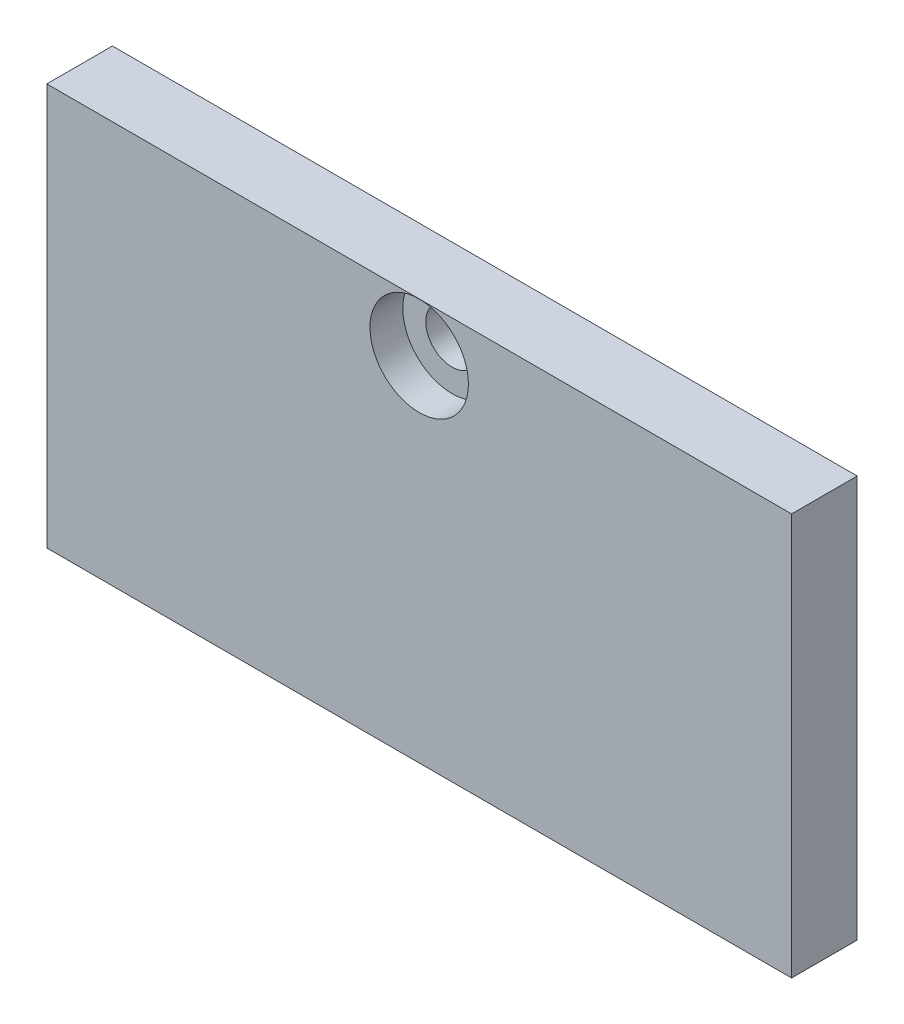
ISO-10303-21;
HEADER;
FILE_DESCRIPTION(('STEP AP214'),'2;1');
FILE_NAME('part.step','',(''),(''),'','','');
FILE_SCHEMA(('AUTOMOTIVE_DESIGN { 1 0 10303 214 1 1 1 1 }'));
ENDSEC;
DATA;
#1=APPLICATION_CONTEXT('core data for automotive mechanical design processes');
#2=APPLICATION_PROTOCOL_DEFINITION('international standard','automotive_design',2000,#1);
#3=PRODUCT_CONTEXT('',#1,'mechanical');
#4=PRODUCT('Part','Part','',(#3));
#5=PRODUCT_RELATED_PRODUCT_CATEGORY('part','',(#4));
#6=PRODUCT_DEFINITION_FORMATION('','',#4);
#7=PRODUCT_DEFINITION_CONTEXT('part definition',#1,'design');
#8=PRODUCT_DEFINITION('design','',#6,#7);
#9=PRODUCT_DEFINITION_SHAPE('','',#8);
#10=(LENGTH_UNIT() NAMED_UNIT(*) SI_UNIT(.MILLI.,.METRE.));
#11=(NAMED_UNIT(*) PLANE_ANGLE_UNIT() SI_UNIT($,.RADIAN.));
#12=(NAMED_UNIT(*) SI_UNIT($,.STERADIAN.) SOLID_ANGLE_UNIT());
#13=UNCERTAINTY_MEASURE_WITH_UNIT(LENGTH_MEASURE(1.E-05),#10,'distance_accuracy_value','');
#14=(GEOMETRIC_REPRESENTATION_CONTEXT(3) GLOBAL_UNCERTAINTY_ASSIGNED_CONTEXT((#13)) GLOBAL_UNIT_ASSIGNED_CONTEXT((#10,
#11,#12)) REPRESENTATION_CONTEXT('',''));
#15=CARTESIAN_POINT('',(0.,0.,0.));
#16=DIRECTION('',(0.,0.,1.));
#17=DIRECTION('',(1.,0.,0.));
#18=AXIS2_PLACEMENT_3D('',#15,#16,#17);
#19=CARTESIAN_POINT('',(-53.7538152649901,35.2169951487221,0.));
#20=DIRECTION('',(0.,0.,1.));
#21=DIRECTION('',(1.,0.,0.));
#22=AXIS2_PLACEMENT_3D('',#19,#20,#21);
#23=CYLINDRICAL_SURFACE('',#22,1.6);
#24=CARTESIAN_POINT('',(-53.7538152649901,35.2169951487221,0.));
#25=DIRECTION('',(0.,0.,1.));
#26=DIRECTION('',(1.,0.,0.));
#27=AXIS2_PLACEMENT_3D('',#24,#25,#26);
#28=CIRCLE('',#27,1.6);
#29=CARTESIAN_POINT('',(-52.1538152649901,35.2169951487221,0.));
#30=VERTEX_POINT('',#29);
#31=EDGE_CURVE('E182',#30,#30,#28,.T.);
#32=ORIENTED_EDGE('',*,*,#31,.F.);
#33=EDGE_LOOP('',(#32));
#34=FACE_BOUND('',#33,.T.);
#35=CARTESIAN_POINT('',(-53.7538152649901,35.2169951487221,2.));
#36=DIRECTION('',(0.,0.,1.));
#37=DIRECTION('',(1.,0.,0.));
#38=AXIS2_PLACEMENT_3D('',#35,#36,#37);
#39=CIRCLE('',#38,1.6);
#40=CARTESIAN_POINT('',(-52.1538152649901,35.2169951487221,2.));
#41=VERTEX_POINT('',#40);
#42=EDGE_CURVE('E179',#41,#41,#39,.F.);
#43=ORIENTED_EDGE('',*,*,#42,.F.);
#44=EDGE_LOOP('',(#43));
#45=FACE_BOUND('',#44,.T.);
#46=ADVANCED_FACE('F39',(#34,#45),#23,.F.);
#47=CARTESIAN_POINT('',(-76.4538152649901,38.2169951487221,4.));
#48=DIRECTION('',(1.,0.,0.));
#49=DIRECTION('',(0.,0.,-1.));
#50=AXIS2_PLACEMENT_3D('',#47,#48,#49);
#51=PLANE('',#50);
#52=DIRECTION('',(0.,-1.,0.));
#53=VECTOR('',#52,1.);
#54=CARTESIAN_POINT('',(-76.4538152649901,38.2169951487221,0.));
#55=LINE('',#54,#53);
#56=CARTESIAN_POINT('',(-76.4538152649901,38.2169951487221,0.));
#57=VERTEX_POINT('',#56);
#58=CARTESIAN_POINT('',(-76.4538152649901,13.7169951487221,0.));
#59=VERTEX_POINT('',#58);
#60=EDGE_CURVE('E186',#57,#59,#55,.T.);
#61=ORIENTED_EDGE('',*,*,#60,.T.);
#62=DIRECTION('',(0.,0.,-1.));
#63=VECTOR('',#62,1.);
#64=CARTESIAN_POINT('',(-76.4538152649901,13.7169951487221,4.));
#65=LINE('',#64,#63);
#66=CARTESIAN_POINT('',(-76.4538152649901,13.7169951487221,4.));
#67=VERTEX_POINT('',#66);
#68=EDGE_CURVE('E226',#67,#59,#65,.T.);
#69=ORIENTED_EDGE('',*,*,#68,.F.);
#70=DIRECTION('',(0.,-1.,0.));
#71=VECTOR('',#70,1.);
#72=CARTESIAN_POINT('',(-76.4538152649901,38.2169951487221,4.));
#73=LINE('',#72,#71);
#74=CARTESIAN_POINT('',(-76.4538152649901,38.2169951487221,4.));
#75=VERTEX_POINT('',#74);
#76=EDGE_CURVE('E187',#75,#67,#73,.T.);
#77=ORIENTED_EDGE('',*,*,#76,.F.);
#78=DIRECTION('',(0.,0.,-1.));
#79=VECTOR('',#78,1.);
#80=CARTESIAN_POINT('',(-76.4538152649901,38.2169951487221,4.));
#81=LINE('',#80,#79);
#82=EDGE_CURVE('E201',#75,#57,#81,.T.);
#83=ORIENTED_EDGE('',*,*,#82,.T.);
#84=EDGE_LOOP('',(#61,#69,#77,#83));
#85=FACE_BOUND('',#84,.T.);
#86=ADVANCED_FACE('F41',(#85),#51,.F.);
#87=CARTESIAN_POINT('',(-76.4538152649901,13.7169951487221,4.));
#88=DIRECTION('',(0.,1.,0.));
#89=DIRECTION('',(0.,0.,1.));
#90=AXIS2_PLACEMENT_3D('',#87,#88,#89);
#91=PLANE('',#90);
#92=DIRECTION('',(1.,0.,0.));
#93=VECTOR('',#92,1.);
#94=CARTESIAN_POINT('',(-76.4538152649901,13.7169951487221,0.));
#95=LINE('',#94,#93);
#96=CARTESIAN_POINT('',(-60.0038152649901,13.7169951487221,0.));
#97=VERTEX_POINT('',#96);
#98=EDGE_CURVE('E206',#59,#97,#95,.T.);
#99=ORIENTED_EDGE('',*,*,#98,.T.);
#100=DIRECTION('',(0.,0.,1.));
#101=VECTOR('',#100,1.);
#102=CARTESIAN_POINT('',(-60.0038152649901,13.7169951487221,4.));
#103=LINE('',#102,#101);
#104=CARTESIAN_POINT('',(-60.0038152649901,13.7169951487221,3.2));
#105=VERTEX_POINT('',#104);
#106=EDGE_CURVE('E158',#97,#105,#103,.T.);
#107=ORIENTED_EDGE('',*,*,#106,.T.);
#108=DIRECTION('',(1.,0.,0.));
#109=VECTOR('',#108,1.);
#110=CARTESIAN_POINT('',(-76.4538152649901,13.7169951487221,3.2));
#111=LINE('',#110,#109);
#112=CARTESIAN_POINT('',(-47.5038152649901,13.7169951487221,3.2));
#113=VERTEX_POINT('',#112);
#114=EDGE_CURVE('E124',#105,#113,#111,.T.);
#115=ORIENTED_EDGE('',*,*,#114,.T.);
#116=DIRECTION('',(0.,0.,-1.));
#117=VECTOR('',#116,1.);
#118=CARTESIAN_POINT('',(-47.5038152649901,13.7169951487221,4.));
#119=LINE('',#118,#117);
#120=CARTESIAN_POINT('',(-47.5038152649901,13.7169951487221,0.));
#121=VERTEX_POINT('',#120);
#122=EDGE_CURVE('E153',#113,#121,#119,.T.);
#123=ORIENTED_EDGE('',*,*,#122,.T.);
#124=CARTESIAN_POINT('',(-31.0538152649901,13.7169951487221,0.));
#125=VERTEX_POINT('',#124);
#126=EDGE_CURVE('E205',#121,#125,#95,.T.);
#127=ORIENTED_EDGE('',*,*,#126,.T.);
#128=DIRECTION('',(0.,0.,-1.));
#129=VECTOR('',#128,1.);
#130=CARTESIAN_POINT('',(-31.0538152649901,13.7169951487221,4.));
#131=LINE('',#130,#129);
#132=CARTESIAN_POINT('',(-31.0538152649901,13.7169951487221,4.));
#133=VERTEX_POINT('',#132);
#134=EDGE_CURVE('E222',#133,#125,#131,.T.);
#135=ORIENTED_EDGE('',*,*,#134,.F.);
#136=DIRECTION('',(1.,0.,0.));
#137=VECTOR('',#136,1.);
#138=CARTESIAN_POINT('',(-76.4538152649901,13.7169951487221,4.));
#139=LINE('',#138,#137);
#140=EDGE_CURVE('E191',#67,#133,#139,.T.);
#141=ORIENTED_EDGE('',*,*,#140,.F.);
#142=ORIENTED_EDGE('',*,*,#68,.T.);
#143=EDGE_LOOP('',(#99,#107,#115,#123,#127,#135,#141,#142));
#144=FACE_BOUND('',#143,.T.);
#145=ADVANCED_FACE('F257',(#144),#91,.F.);
#146=CARTESIAN_POINT('',(-31.0538152649901,38.2169951487221,4.));
#147=DIRECTION('',(-1.,0.,0.));
#148=DIRECTION('',(0.,0.,1.));
#149=AXIS2_PLACEMENT_3D('',#146,#147,#148);
#150=PLANE('',#149);
#151=DIRECTION('',(0.,1.,0.));
#152=VECTOR('',#151,1.);
#153=CARTESIAN_POINT('',(-31.0538152649901,38.2169951487221,0.));
#154=LINE('',#153,#152);
#155=CARTESIAN_POINT('',(-31.0538152649901,38.2169951487221,0.));
#156=VERTEX_POINT('',#155);
#157=EDGE_CURVE('E210',#125,#156,#154,.T.);
#158=ORIENTED_EDGE('',*,*,#157,.T.);
#159=DIRECTION('',(0.,0.,-1.));
#160=VECTOR('',#159,1.);
#161=CARTESIAN_POINT('',(-31.0538152649901,38.2169951487221,4.));
#162=LINE('',#161,#160);
#163=CARTESIAN_POINT('',(-31.0538152649901,38.2169951487221,4.));
#164=VERTEX_POINT('',#163);
#165=EDGE_CURVE('E218',#164,#156,#162,.T.);
#166=ORIENTED_EDGE('',*,*,#165,.F.);
#167=DIRECTION('',(0.,1.,0.));
#168=VECTOR('',#167,1.);
#169=CARTESIAN_POINT('',(-31.0538152649901,38.2169951487221,4.));
#170=LINE('',#169,#168);
#171=EDGE_CURVE('E195',#133,#164,#170,.T.);
#172=ORIENTED_EDGE('',*,*,#171,.F.);
#173=ORIENTED_EDGE('',*,*,#134,.T.);
#174=EDGE_LOOP('',(#158,#166,#172,#173));
#175=FACE_BOUND('',#174,.T.);
#176=ADVANCED_FACE('F271',(#175),#150,.F.);
#177=CARTESIAN_POINT('',(-76.4538152649901,38.2169951487221,4.));
#178=DIRECTION('',(0.,-1.,0.));
#179=DIRECTION('',(0.,0.,-1.));
#180=AXIS2_PLACEMENT_3D('',#177,#178,#179);
#181=PLANE('',#180);
#182=DIRECTION('',(-1.,0.,0.));
#183=VECTOR('',#182,1.);
#184=CARTESIAN_POINT('',(-76.4538152649901,38.2169951487221,0.));
#185=LINE('',#184,#183);
#186=EDGE_CURVE('E192',#156,#57,#185,.T.);
#187=ORIENTED_EDGE('',*,*,#186,.T.);
#188=ORIENTED_EDGE('',*,*,#82,.F.);
#189=DIRECTION('',(-1.,0.,0.));
#190=VECTOR('',#189,1.);
#191=CARTESIAN_POINT('',(-76.4538152649901,38.2169951487221,4.));
#192=LINE('',#191,#190);
#193=EDGE_CURVE('E198',#164,#75,#192,.T.);
#194=ORIENTED_EDGE('',*,*,#193,.F.);
#195=ORIENTED_EDGE('',*,*,#165,.T.);
#196=EDGE_LOOP('',(#187,#188,#194,#195));
#197=FACE_BOUND('',#196,.T.);
#198=ADVANCED_FACE('F267',(#197),#181,.F.);
#199=CARTESIAN_POINT('',(0.,0.,4.));
#200=DIRECTION('',(0.,0.,1.));
#201=DIRECTION('',(1.,0.,0.));
#202=AXIS2_PLACEMENT_3D('',#199,#200,#201);
#203=PLANE('',#202);
#204=CARTESIAN_POINT('',(-53.7538152649901,35.2169951487221,4.));
#205=DIRECTION('',(0.,0.,1.));
#206=DIRECTION('',(1.,0.,0.));
#207=AXIS2_PLACEMENT_3D('',#204,#205,#206);
#208=CIRCLE('',#207,3.);
#209=CARTESIAN_POINT('',(-54.0633748787031,38.2009812153045,4.));
#210=VERTEX_POINT('',#209);
#211=CARTESIAN_POINT('',(-53.4865016984781,38.2050619915418,4.));
#212=VERTEX_POINT('',#211);
#213=EDGE_CURVE('E63',#210,#212,#208,.T.);
#214=ORIENTED_EDGE('',*,*,#213,.F.);
#215=DIRECTION('',(-0.99997498050314,-0.00707378030085412,0.));
#216=VECTOR('',#215,1.);
#217=CARTESIAN_POINT('',(-54.0633748787031,38.2009812153045,4.));
#218=LINE('',#217,#216);
#219=EDGE_CURVE('E166',#212,#210,#218,.T.);
#220=ORIENTED_EDGE('',*,*,#219,.F.);
#221=EDGE_LOOP('',(#214,#220));
#222=FACE_BOUND('',#221,.T.);
#223=ORIENTED_EDGE('',*,*,#76,.T.);
#224=ORIENTED_EDGE('',*,*,#140,.T.);
#225=ORIENTED_EDGE('',*,*,#171,.T.);
#226=ORIENTED_EDGE('',*,*,#193,.T.);
#227=EDGE_LOOP('',(#223,#224,#225,#226));
#228=FACE_BOUND('',#227,.T.);
#229=ADVANCED_FACE('F246',(#222,#228),#203,.T.);
#230=CARTESIAN_POINT('',(0.,0.,0.));
#231=DIRECTION('',(0.,0.,1.));
#232=DIRECTION('',(1.,0.,0.));
#233=AXIS2_PLACEMENT_3D('',#230,#231,#232);
#234=PLANE('',#233);
#235=CARTESIAN_POINT('',(-63.0385821738426,31.503088385181,0.));
#236=DIRECTION('',(0.,0.,1.));
#237=DIRECTION('',(1.,0.,0.));
#238=AXIS2_PLACEMENT_3D('',#235,#236,#237);
#239=CIRCLE('',#238,2.9);
#240=CARTESIAN_POINT('',(-60.1385821738426,31.503088385181,0.));
#241=VERTEX_POINT('',#240);
#242=EDGE_CURVE('E11',#241,#241,#239,.F.);
#243=ORIENTED_EDGE('',*,*,#242,.F.);
#244=EDGE_LOOP('',(#243));
#245=FACE_BOUND('',#244,.T.);
#246=CARTESIAN_POINT('',(-44.4690483561375,31.503088385181,0.));
#247=DIRECTION('',(0.,0.,1.));
#248=DIRECTION('',(1.,0.,0.));
#249=AXIS2_PLACEMENT_3D('',#246,#247,#248);
#250=CIRCLE('',#249,2.9);
#251=CARTESIAN_POINT('',(-41.5690483561375,31.503088385181,0.));
#252=VERTEX_POINT('',#251);
#253=EDGE_CURVE('E48',#252,#252,#250,.F.);
#254=ORIENTED_EDGE('',*,*,#253,.F.);
#255=EDGE_LOOP('',(#254));
#256=FACE_BOUND('',#255,.T.);
#257=ORIENTED_EDGE('',*,*,#31,.T.);
#258=EDGE_LOOP('',(#257));
#259=FACE_BOUND('',#258,.T.);
#260=DIRECTION('',(1.,0.,0.));
#261=VECTOR('',#260,1.);
#262=CARTESIAN_POINT('',(-47.5038152649901,31.7169951487221,0.));
#263=LINE('',#262,#261);
#264=CARTESIAN_POINT('',(-60.0038152649901,31.7169951487221,0.));
#265=VERTEX_POINT('',#264);
#266=CARTESIAN_POINT('',(-47.5038152649901,31.7169951487221,0.));
#267=VERTEX_POINT('',#266);
#268=EDGE_CURVE('E146',#265,#267,#263,.T.);
#269=ORIENTED_EDGE('',*,*,#268,.F.);
#270=DIRECTION('',(0.,-1.,0.));
#271=VECTOR('',#270,1.);
#272=CARTESIAN_POINT('',(-60.0038152649901,0.,0.));
#273=LINE('',#272,#271);
#274=EDGE_CURVE('E132',#265,#97,#273,.T.);
#275=ORIENTED_EDGE('',*,*,#274,.T.);
#276=ORIENTED_EDGE('',*,*,#98,.F.);
#277=ORIENTED_EDGE('',*,*,#60,.F.);
#278=ORIENTED_EDGE('',*,*,#186,.F.);
#279=ORIENTED_EDGE('',*,*,#157,.F.);
#280=ORIENTED_EDGE('',*,*,#126,.F.);
#281=DIRECTION('',(0.,-1.,0.));
#282=VECTOR('',#281,1.);
#283=CARTESIAN_POINT('',(-47.5038152649901,-4.28300485127793,0.));
#284=LINE('',#283,#282);
#285=EDGE_CURVE('E128',#267,#121,#284,.T.);
#286=ORIENTED_EDGE('',*,*,#285,.F.);
#287=EDGE_LOOP('',(#269,#275,#276,#277,#278,#279,#280,#286));
#288=FACE_BOUND('',#287,.T.);
#289=ADVANCED_FACE('F242',(#245,#256,#259,#288),#234,.F.);
#290=CARTESIAN_POINT('',(-53.7538152649901,35.2169951487221,2.));
#291=DIRECTION('',(0.,0.,1.));
#292=DIRECTION('',(1.,0.,0.));
#293=AXIS2_PLACEMENT_3D('',#290,#291,#292);
#294=PLANE('',#293);
#295=CARTESIAN_POINT('',(-53.7538152649901,35.2169951487221,2.));
#296=DIRECTION('',(0.,0.,1.));
#297=DIRECTION('',(1.,0.,0.));
#298=AXIS2_PLACEMENT_3D('',#295,#296,#297);
#299=CIRCLE('',#298,3.);
#300=CARTESIAN_POINT('',(-54.0633748787031,38.2009812153045,2.));
#301=VERTEX_POINT('',#300);
#302=CARTESIAN_POINT('',(-53.4865016984781,38.2050619915418,2.));
#303=VERTEX_POINT('',#302);
#304=EDGE_CURVE('E161',#301,#303,#299,.T.);
#305=ORIENTED_EDGE('',*,*,#304,.T.);
#306=DIRECTION('',(-0.99997498050314,-0.00707378030085412,0.));
#307=VECTOR('',#306,1.);
#308=CARTESIAN_POINT('',(-54.0633748787031,38.2009812153045,2.));
#309=LINE('',#308,#307);
#310=EDGE_CURVE('E165',#303,#301,#309,.T.);
#311=ORIENTED_EDGE('',*,*,#310,.T.);
#312=EDGE_LOOP('',(#305,#311));
#313=FACE_BOUND('',#312,.T.);
#314=ORIENTED_EDGE('',*,*,#42,.T.);
#315=EDGE_LOOP('',(#314));
#316=FACE_BOUND('',#315,.T.);
#317=ADVANCED_FACE('F245',(#313,#316),#294,.T.);
#318=CARTESIAN_POINT('',(-53.7538152649901,35.2169951487221,2.));
#319=DIRECTION('',(0.,0.,1.));
#320=DIRECTION('',(1.,0.,0.));
#321=AXIS2_PLACEMENT_3D('',#318,#319,#320);
#322=CYLINDRICAL_SURFACE('',#321,3.);
#323=ORIENTED_EDGE('',*,*,#213,.T.);
#324=DIRECTION('',(0.,0.,1.));
#325=VECTOR('',#324,1.);
#326=CARTESIAN_POINT('',(-53.4865016984781,38.2050619915418,2.));
#327=LINE('',#326,#325);
#328=EDGE_CURVE('E170',#303,#212,#327,.T.);
#329=ORIENTED_EDGE('',*,*,#328,.F.);
#330=ORIENTED_EDGE('',*,*,#304,.F.);
#331=DIRECTION('',(0.,0.,1.));
#332=VECTOR('',#331,1.);
#333=CARTESIAN_POINT('',(-54.0633748787031,38.2009812153045,2.));
#334=LINE('',#333,#332);
#335=EDGE_CURVE('E176',#301,#210,#334,.T.);
#336=ORIENTED_EDGE('',*,*,#335,.T.);
#337=EDGE_LOOP('',(#323,#329,#330,#336));
#338=FACE_BOUND('',#337,.T.);
#339=ADVANCED_FACE('F288',(#338),#322,.F.);
#340=CARTESIAN_POINT('',(-54.0633748787031,38.2009812153045,2.));
#341=DIRECTION('',(-0.00707378030085412,0.99997498050314,0.));
#342=DIRECTION('',(-0.99997498050314,-0.00707378030085412,0.));
#343=AXIS2_PLACEMENT_3D('',#340,#341,#342);
#344=PLANE('',#343);
#345=ORIENTED_EDGE('',*,*,#219,.T.);
#346=ORIENTED_EDGE('',*,*,#335,.F.);
#347=ORIENTED_EDGE('',*,*,#310,.F.);
#348=ORIENTED_EDGE('',*,*,#328,.T.);
#349=EDGE_LOOP('',(#345,#346,#347,#348));
#350=FACE_BOUND('',#349,.T.);
#351=ADVANCED_FACE('F291',(#350),#344,.F.);
#352=CARTESIAN_POINT('',(0.,0.,3.2));
#353=DIRECTION('',(0.,0.,1.));
#354=DIRECTION('',(1.,0.,0.));
#355=AXIS2_PLACEMENT_3D('',#352,#353,#354);
#356=PLANE('',#355);
#357=DIRECTION('',(0.,1.,0.));
#358=VECTOR('',#357,1.);
#359=CARTESIAN_POINT('',(-60.0038152649901,-4.28300485127793,3.2));
#360=LINE('',#359,#358);
#361=CARTESIAN_POINT('',(-60.0038152649901,31.7169951487221,3.2));
#362=VERTEX_POINT('',#361);
#363=EDGE_CURVE('E119',#105,#362,#360,.T.);
#364=ORIENTED_EDGE('',*,*,#363,.T.);
#365=DIRECTION('',(1.,0.,0.));
#366=VECTOR('',#365,1.);
#367=CARTESIAN_POINT('',(-47.5038152649901,31.7169951487221,3.2));
#368=LINE('',#367,#366);
#369=CARTESIAN_POINT('',(-47.5038152649901,31.7169951487221,3.2));
#370=VERTEX_POINT('',#369);
#371=EDGE_CURVE('E122',#362,#370,#368,.T.);
#372=ORIENTED_EDGE('',*,*,#371,.T.);
#373=DIRECTION('',(0.,-1.,0.));
#374=VECTOR('',#373,1.);
#375=CARTESIAN_POINT('',(-47.5038152649901,-4.28300485127793,3.2));
#376=LINE('',#375,#374);
#377=EDGE_CURVE('E136',#370,#113,#376,.T.);
#378=ORIENTED_EDGE('',*,*,#377,.T.);
#379=ORIENTED_EDGE('',*,*,#114,.F.);
#380=EDGE_LOOP('',(#364,#372,#378,#379));
#381=FACE_BOUND('',#380,.T.);
#382=ADVANCED_FACE('F120',(#381),#356,.F.);
#383=CARTESIAN_POINT('',(-60.0038152649901,-4.28300485127793,3.2));
#384=DIRECTION('',(-1.,0.,0.));
#385=DIRECTION('',(0.,0.,1.));
#386=AXIS2_PLACEMENT_3D('',#383,#384,#385);
#387=PLANE('',#386);
#388=ORIENTED_EDGE('',*,*,#274,.F.);
#389=DIRECTION('',(0.,0.,-1.));
#390=VECTOR('',#389,1.);
#391=CARTESIAN_POINT('',(-60.0038152649901,31.7169951487221,3.2));
#392=LINE('',#391,#390);
#393=EDGE_CURVE('E55',#362,#265,#392,.T.);
#394=ORIENTED_EDGE('',*,*,#393,.F.);
#395=ORIENTED_EDGE('',*,*,#363,.F.);
#396=ORIENTED_EDGE('',*,*,#106,.F.);
#397=EDGE_LOOP('',(#388,#394,#395,#396));
#398=FACE_BOUND('',#397,.T.);
#399=ADVANCED_FACE('F130',(#398),#387,.F.);
#400=CARTESIAN_POINT('',(-47.5038152649901,-4.28300485127793,3.2));
#401=DIRECTION('',(1.,0.,0.));
#402=DIRECTION('',(0.,0.,-1.));
#403=AXIS2_PLACEMENT_3D('',#400,#401,#402);
#404=PLANE('',#403);
#405=ORIENTED_EDGE('',*,*,#377,.F.);
#406=DIRECTION('',(0.,0.,-1.));
#407=VECTOR('',#406,1.);
#408=CARTESIAN_POINT('',(-47.5038152649901,31.7169951487221,3.2));
#409=LINE('',#408,#407);
#410=EDGE_CURVE('E135',#370,#267,#409,.T.);
#411=ORIENTED_EDGE('',*,*,#410,.T.);
#412=ORIENTED_EDGE('',*,*,#285,.T.);
#413=ORIENTED_EDGE('',*,*,#122,.F.);
#414=EDGE_LOOP('',(#405,#411,#412,#413));
#415=FACE_BOUND('',#414,.T.);
#416=ADVANCED_FACE('F255',(#415),#404,.F.);
#417=CARTESIAN_POINT('',(-47.5038152649901,31.7169951487221,3.2));
#418=DIRECTION('',(0.,1.,0.));
#419=DIRECTION('',(0.,0.,1.));
#420=AXIS2_PLACEMENT_3D('',#417,#418,#419);
#421=PLANE('',#420);
#422=ORIENTED_EDGE('',*,*,#268,.T.);
#423=ORIENTED_EDGE('',*,*,#410,.F.);
#424=ORIENTED_EDGE('',*,*,#371,.F.);
#425=ORIENTED_EDGE('',*,*,#393,.T.);
#426=EDGE_LOOP('',(#422,#423,#424,#425));
#427=FACE_BOUND('',#426,.T.);
#428=ADVANCED_FACE('F138',(#427),#421,.F.);
#429=CARTESIAN_POINT('',(-44.4690483561375,31.503088385181,-1.7));
#430=DIRECTION('',(0.,0.,1.));
#431=DIRECTION('',(1.,0.,0.));
#432=AXIS2_PLACEMENT_3D('',#429,#430,#431);
#433=CYLINDRICAL_SURFACE('',#432,2.9);
#434=CARTESIAN_POINT('',(-44.4690483561375,31.503088385181,-1.7));
#435=DIRECTION('',(0.,0.,-1.));
#436=DIRECTION('',(-1.,0.,0.));
#437=AXIS2_PLACEMENT_3D('',#434,#435,#436);
#438=CIRCLE('',#437,2.9);
#439=CARTESIAN_POINT('',(-47.3690483561375,31.503088385181,-1.7));
#440=VERTEX_POINT('',#439);
#441=EDGE_CURVE('E149',#440,#440,#438,.T.);
#442=ORIENTED_EDGE('',*,*,#441,.F.);
#443=EDGE_LOOP('',(#442));
#444=FACE_BOUND('',#443,.T.);
#445=ORIENTED_EDGE('',*,*,#253,.T.);
#446=EDGE_LOOP('',(#445));
#447=FACE_BOUND('',#446,.T.);
#448=ADVANCED_FACE('F240',(#444,#447),#433,.T.);
#449=CARTESIAN_POINT('',(-44.4690483561375,31.503088385181,-1.7));
#450=DIRECTION('',(0.,0.,-1.));
#451=DIRECTION('',(-1.,0.,0.));
#452=AXIS2_PLACEMENT_3D('',#449,#450,#451);
#453=PLANE('',#452);
#454=ORIENTED_EDGE('',*,*,#441,.T.);
#455=EDGE_LOOP('',(#454));
#456=FACE_BOUND('',#455,.T.);
#457=ADVANCED_FACE('F308',(#456),#453,.T.);
#458=CARTESIAN_POINT('',(-63.0385821738426,31.503088385181,-1.7));
#459=DIRECTION('',(0.,0.,1.));
#460=DIRECTION('',(1.,0.,0.));
#461=AXIS2_PLACEMENT_3D('',#458,#459,#460);
#462=CYLINDRICAL_SURFACE('',#461,2.9);
#463=CARTESIAN_POINT('',(-63.0385821738426,31.503088385181,-1.7));
#464=DIRECTION('',(0.,0.,-1.));
#465=DIRECTION('',(1.,0.,0.));
#466=AXIS2_PLACEMENT_3D('',#463,#464,#465);
#467=CIRCLE('',#466,2.9);
#468=CARTESIAN_POINT('',(-60.1385821738426,31.503088385181,-1.7));
#469=VERTEX_POINT('',#468);
#470=EDGE_CURVE('E324',#469,#469,#467,.T.);
#471=ORIENTED_EDGE('',*,*,#470,.F.);
#472=EDGE_LOOP('',(#471));
#473=FACE_BOUND('',#472,.T.);
#474=ORIENTED_EDGE('',*,*,#242,.T.);
#475=EDGE_LOOP('',(#474));
#476=FACE_BOUND('',#475,.T.);
#477=ADVANCED_FACE('F312',(#473,#476),#462,.T.);
#478=CARTESIAN_POINT('',(-63.0385821738426,31.503088385181,-1.7));
#479=DIRECTION('',(0.,0.,1.));
#480=DIRECTION('',(1.,0.,0.));
#481=AXIS2_PLACEMENT_3D('',#478,#479,#480);
#482=PLANE('',#481);
#483=ORIENTED_EDGE('',*,*,#470,.T.);
#484=EDGE_LOOP('',(#483));
#485=FACE_BOUND('',#484,.T.);
#486=ADVANCED_FACE('F316',(#485),#482,.F.);
#487=CLOSED_SHELL('',(#46,#86,#145,#176,#198,#229,#289,#317,#339,#351,#382,#399,#416,#428,#448,
#457,#477,#486));
#488=MANIFOLD_SOLID_BREP('B2',#487);
#489=ADVANCED_BREP_SHAPE_REPRESENTATION('',(#18,#488),#14);
#490=SHAPE_DEFINITION_REPRESENTATION(#9,#489);
ENDSEC;
END-ISO-10303-21;
